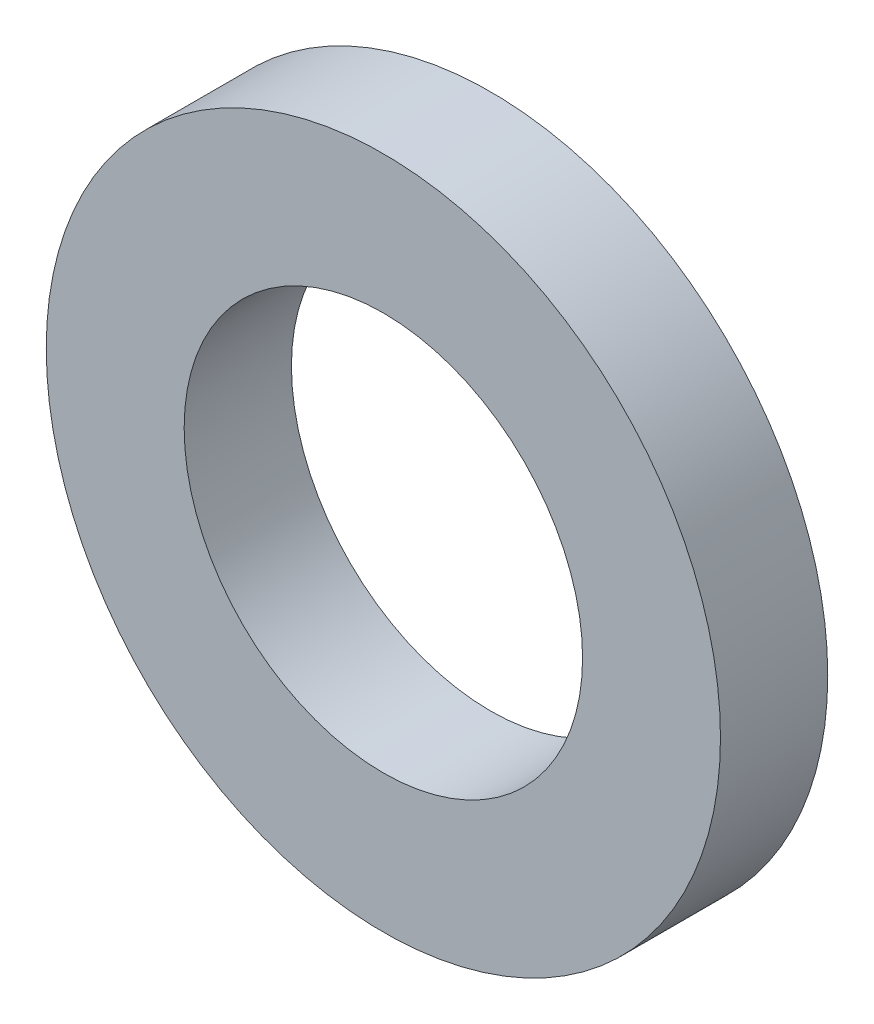
ISO-10303-21;
HEADER;
FILE_DESCRIPTION(('STEP AP214'),'2;1');
FILE_NAME('part.step','',(''),(''),'','','');
FILE_SCHEMA(('AUTOMOTIVE_DESIGN { 1 0 10303 214 1 1 1 1 }'));
ENDSEC;
DATA;
#1=APPLICATION_CONTEXT('core data for automotive mechanical design processes');
#2=APPLICATION_PROTOCOL_DEFINITION('international standard','automotive_design',2000,#1);
#3=PRODUCT_CONTEXT('',#1,'mechanical');
#4=PRODUCT('Part','Part','',(#3));
#5=PRODUCT_RELATED_PRODUCT_CATEGORY('part','',(#4));
#6=PRODUCT_DEFINITION_FORMATION('','',#4);
#7=PRODUCT_DEFINITION_CONTEXT('part definition',#1,'design');
#8=PRODUCT_DEFINITION('design','',#6,#7);
#9=PRODUCT_DEFINITION_SHAPE('','',#8);
#10=(LENGTH_UNIT() NAMED_UNIT(*) SI_UNIT(.MILLI.,.METRE.));
#11=(NAMED_UNIT(*) PLANE_ANGLE_UNIT() SI_UNIT($,.RADIAN.));
#12=(NAMED_UNIT(*) SI_UNIT($,.STERADIAN.) SOLID_ANGLE_UNIT());
#13=UNCERTAINTY_MEASURE_WITH_UNIT(LENGTH_MEASURE(1.E-05),#10,'distance_accuracy_value','');
#14=(GEOMETRIC_REPRESENTATION_CONTEXT(3) GLOBAL_UNCERTAINTY_ASSIGNED_CONTEXT((#13)) GLOBAL_UNIT_ASSIGNED_CONTEXT((#10,
#11,#12)) REPRESENTATION_CONTEXT('',''));
#15=CARTESIAN_POINT('',(0.,0.,0.));
#16=DIRECTION('',(0.,0.,1.));
#17=DIRECTION('',(1.,0.,0.));
#18=AXIS2_PLACEMENT_3D('',#15,#16,#17);
#19=CARTESIAN_POINT('',(0.,0.,3.5));
#20=DIRECTION('',(0.,0.,-1.));
#21=DIRECTION('',(-1.,0.,0.));
#22=AXIS2_PLACEMENT_3D('',#19,#20,#21);
#23=CYLINDRICAL_SURFACE('',#22,11.);
#24=CARTESIAN_POINT('',(0.,0.,3.5));
#25=DIRECTION('',(0.,0.,1.));
#26=DIRECTION('',(1.,0.,0.));
#27=AXIS2_PLACEMENT_3D('',#24,#25,#26);
#28=CIRCLE('',#27,11.);
#29=CARTESIAN_POINT('',(11.,0.,3.5));
#30=VERTEX_POINT('',#29);
#31=EDGE_CURVE('E10',#30,#30,#28,.T.);
#32=ORIENTED_EDGE('',*,*,#31,.F.);
#33=EDGE_LOOP('',(#32));
#34=FACE_BOUND('',#33,.T.);
#35=CARTESIAN_POINT('',(0.,0.,0.));
#36=DIRECTION('',(0.,0.,1.));
#37=DIRECTION('',(1.,0.,0.));
#38=AXIS2_PLACEMENT_3D('',#35,#36,#37);
#39=CIRCLE('',#38,11.);
#40=CARTESIAN_POINT('',(11.,0.,0.));
#41=VERTEX_POINT('',#40);
#42=EDGE_CURVE('E36',#41,#41,#39,.T.);
#43=ORIENTED_EDGE('',*,*,#42,.T.);
#44=EDGE_LOOP('',(#43));
#45=FACE_BOUND('',#44,.T.);
#46=ADVANCED_FACE('F33',(#34,#45),#23,.T.);
#47=CARTESIAN_POINT('',(0.,0.,3.5));
#48=DIRECTION('',(0.,0.,1.));
#49=DIRECTION('',(1.,0.,0.));
#50=AXIS2_PLACEMENT_3D('',#47,#48,#49);
#51=PLANE('',#50);
#52=CARTESIAN_POINT('',(0.,0.,3.5));
#53=DIRECTION('',(0.,0.,-1.));
#54=DIRECTION('',(-1.,0.,0.));
#55=AXIS2_PLACEMENT_3D('',#52,#53,#54);
#56=CIRCLE('',#55,6.5);
#57=CARTESIAN_POINT('',(-6.5,0.,3.5));
#58=VERTEX_POINT('',#57);
#59=EDGE_CURVE('E43',#58,#58,#56,.T.);
#60=ORIENTED_EDGE('',*,*,#59,.T.);
#61=EDGE_LOOP('',(#60));
#62=FACE_BOUND('',#61,.T.);
#63=ORIENTED_EDGE('',*,*,#31,.T.);
#64=EDGE_LOOP('',(#63));
#65=FACE_BOUND('',#64,.T.);
#66=ADVANCED_FACE('F51',(#62,#65),#51,.T.);
#67=CARTESIAN_POINT('',(0.,0.,0.));
#68=DIRECTION('',(0.,0.,1.));
#69=DIRECTION('',(1.,0.,0.));
#70=AXIS2_PLACEMENT_3D('',#67,#68,#69);
#71=PLANE('',#70);
#72=CARTESIAN_POINT('',(0.,0.,0.));
#73=DIRECTION('',(0.,0.,-1.));
#74=DIRECTION('',(-1.,0.,0.));
#75=AXIS2_PLACEMENT_3D('',#72,#73,#74);
#76=CIRCLE('',#75,6.5);
#77=CARTESIAN_POINT('',(-6.5,0.,0.));
#78=VERTEX_POINT('',#77);
#79=EDGE_CURVE('E45',#78,#78,#76,.T.);
#80=ORIENTED_EDGE('',*,*,#79,.F.);
#81=EDGE_LOOP('',(#80));
#82=FACE_BOUND('',#81,.T.);
#83=ORIENTED_EDGE('',*,*,#42,.F.);
#84=EDGE_LOOP('',(#83));
#85=FACE_BOUND('',#84,.T.);
#86=ADVANCED_FACE('F56',(#82,#85),#71,.F.);
#87=CARTESIAN_POINT('',(0.,0.,3.5));
#88=DIRECTION('',(0.,0.,-1.));
#89=DIRECTION('',(-1.,0.,0.));
#90=AXIS2_PLACEMENT_3D('',#87,#88,#89);
#91=CYLINDRICAL_SURFACE('',#90,6.5);
#92=ORIENTED_EDGE('',*,*,#59,.F.);
#93=EDGE_LOOP('',(#92));
#94=FACE_BOUND('',#93,.T.);
#95=ORIENTED_EDGE('',*,*,#79,.T.);
#96=EDGE_LOOP('',(#95));
#97=FACE_BOUND('',#96,.T.);
#98=ADVANCED_FACE('F53',(#94,#97),#91,.F.);
#99=CLOSED_SHELL('',(#46,#66,#86,#98));
#100=MANIFOLD_SOLID_BREP('B2',#99);
#101=ADVANCED_BREP_SHAPE_REPRESENTATION('',(#18,#100),#14);
#102=SHAPE_DEFINITION_REPRESENTATION(#9,#101);
ENDSEC;
END-ISO-10303-21;
